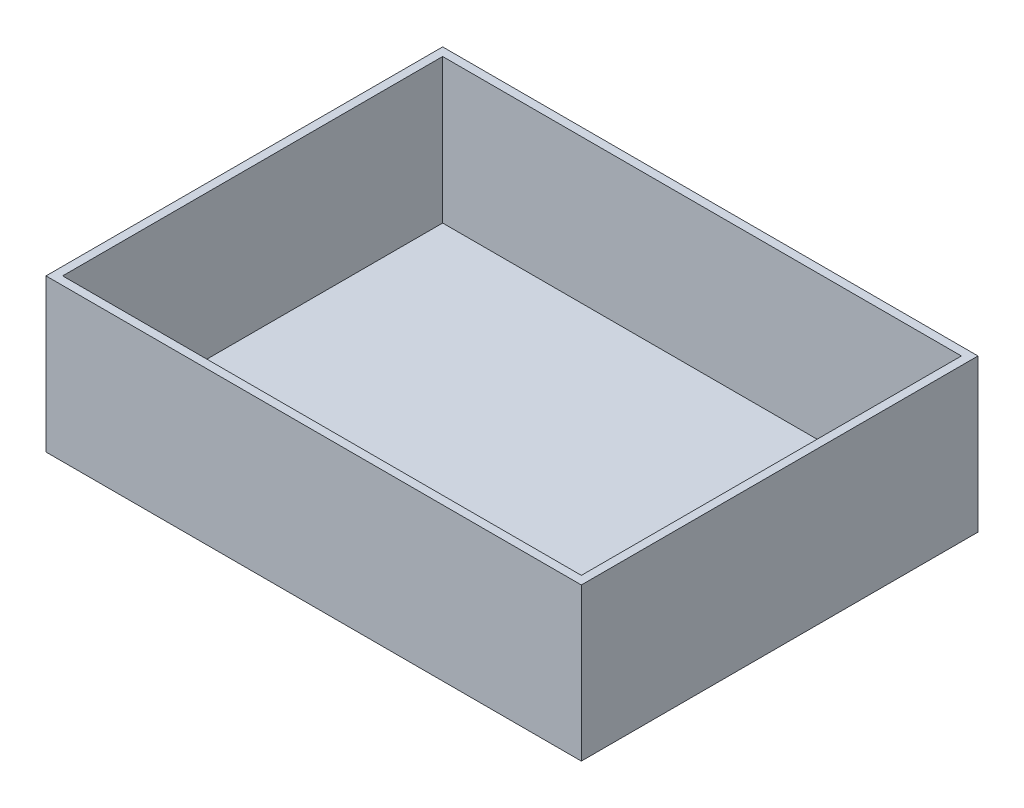
ISO-10303-21;
HEADER;
FILE_DESCRIPTION(('STEP AP214'),'2;1');
FILE_NAME('part.step','',(''),(''),'','','');
FILE_SCHEMA(('AUTOMOTIVE_DESIGN { 1 0 10303 214 1 1 1 1 }'));
ENDSEC;
DATA;
#1=APPLICATION_CONTEXT('core data for automotive mechanical design processes');
#2=APPLICATION_PROTOCOL_DEFINITION('international standard','automotive_design',2000,#1);
#3=PRODUCT_CONTEXT('',#1,'mechanical');
#4=PRODUCT('Part','Part','',(#3));
#5=PRODUCT_RELATED_PRODUCT_CATEGORY('part','',(#4));
#6=PRODUCT_DEFINITION_FORMATION('','',#4);
#7=PRODUCT_DEFINITION_CONTEXT('part definition',#1,'design');
#8=PRODUCT_DEFINITION('design','',#6,#7);
#9=PRODUCT_DEFINITION_SHAPE('','',#8);
#10=(LENGTH_UNIT() NAMED_UNIT(*) SI_UNIT(.MILLI.,.METRE.));
#11=(NAMED_UNIT(*) PLANE_ANGLE_UNIT() SI_UNIT($,.RADIAN.));
#12=(NAMED_UNIT(*) SI_UNIT($,.STERADIAN.) SOLID_ANGLE_UNIT());
#13=UNCERTAINTY_MEASURE_WITH_UNIT(LENGTH_MEASURE(1.E-05),#10,'distance_accuracy_value','');
#14=(GEOMETRIC_REPRESENTATION_CONTEXT(3) GLOBAL_UNCERTAINTY_ASSIGNED_CONTEXT((#13)) GLOBAL_UNIT_ASSIGNED_CONTEXT((#10,
#11,#12)) REPRESENTATION_CONTEXT('',''));
#15=CARTESIAN_POINT('',(0.,0.,0.));
#16=DIRECTION('',(0.,0.,1.));
#17=DIRECTION('',(1.,0.,0.));
#18=AXIS2_PLACEMENT_3D('',#15,#16,#17);
#19=CARTESIAN_POINT('',(0.,55.,0.));
#20=DIRECTION('',(0.,-1.,0.));
#21=DIRECTION('',(0.,0.,-1.));
#22=AXIS2_PLACEMENT_3D('',#19,#20,#21);
#23=PLANE('',#22);
#24=DIRECTION('',(0.,0.,-1.));
#25=VECTOR('',#24,1.);
#26=CARTESIAN_POINT('',(96.5,55.,71.5));
#27=LINE('',#26,#25);
#28=CARTESIAN_POINT('',(96.5,55.,71.5));
#29=VERTEX_POINT('',#28);
#30=CARTESIAN_POINT('',(96.5,55.,-71.5));
#31=VERTEX_POINT('',#30);
#32=EDGE_CURVE('E141',#29,#31,#27,.T.);
#33=ORIENTED_EDGE('',*,*,#32,.T.);
#34=DIRECTION('',(-1.,0.,0.));
#35=VECTOR('',#34,1.);
#36=CARTESIAN_POINT('',(-96.5,55.,-71.5));
#37=LINE('',#36,#35);
#38=CARTESIAN_POINT('',(-96.5,55.,-71.5));
#39=VERTEX_POINT('',#38);
#40=EDGE_CURVE('E85',#31,#39,#37,.T.);
#41=ORIENTED_EDGE('',*,*,#40,.T.);
#42=DIRECTION('',(0.,0.,1.));
#43=VECTOR('',#42,1.);
#44=CARTESIAN_POINT('',(-96.5,55.,71.5));
#45=LINE('',#44,#43);
#46=CARTESIAN_POINT('',(-96.5,55.,71.5));
#47=VERTEX_POINT('',#46);
#48=EDGE_CURVE('E144',#39,#47,#45,.T.);
#49=ORIENTED_EDGE('',*,*,#48,.T.);
#50=DIRECTION('',(1.,0.,0.));
#51=VECTOR('',#50,1.);
#52=CARTESIAN_POINT('',(-96.5,55.,71.5));
#53=LINE('',#52,#51);
#54=EDGE_CURVE('E57',#47,#29,#53,.T.);
#55=ORIENTED_EDGE('',*,*,#54,.T.);
#56=EDGE_LOOP('',(#33,#41,#49,#55));
#57=FACE_BOUND('',#56,.T.);
#58=DIRECTION('',(0.,0.,-1.));
#59=VECTOR('',#58,1.);
#60=CARTESIAN_POINT('',(93.5,55.,0.));
#61=LINE('',#60,#59);
#62=CARTESIAN_POINT('',(93.5,55.,68.5));
#63=VERTEX_POINT('',#62);
#64=CARTESIAN_POINT('',(93.5,55.,-68.5));
#65=VERTEX_POINT('',#64);
#66=EDGE_CURVE('E130',#63,#65,#61,.T.);
#67=ORIENTED_EDGE('',*,*,#66,.F.);
#68=DIRECTION('',(1.,0.,0.));
#69=VECTOR('',#68,1.);
#70=CARTESIAN_POINT('',(0.,55.,68.5));
#71=LINE('',#70,#69);
#72=CARTESIAN_POINT('',(-93.5,55.,68.5));
#73=VERTEX_POINT('',#72);
#74=EDGE_CURVE('E139',#73,#63,#71,.T.);
#75=ORIENTED_EDGE('',*,*,#74,.F.);
#76=DIRECTION('',(0.,0.,1.));
#77=VECTOR('',#76,1.);
#78=CARTESIAN_POINT('',(-93.5,55.,0.));
#79=LINE('',#78,#77);
#80=CARTESIAN_POINT('',(-93.5,55.,-68.5));
#81=VERTEX_POINT('',#80);
#82=EDGE_CURVE('E137',#81,#73,#79,.T.);
#83=ORIENTED_EDGE('',*,*,#82,.F.);
#84=DIRECTION('',(-1.,0.,0.));
#85=VECTOR('',#84,1.);
#86=CARTESIAN_POINT('',(0.,55.,-68.5));
#87=LINE('',#86,#85);
#88=EDGE_CURVE('E122',#65,#81,#87,.T.);
#89=ORIENTED_EDGE('',*,*,#88,.F.);
#90=EDGE_LOOP('',(#67,#75,#83,#89));
#91=FACE_BOUND('',#90,.T.);
#92=ADVANCED_FACE('F33',(#57,#91),#23,.F.);
#93=CARTESIAN_POINT('',(96.5,55.,71.5));
#94=DIRECTION('',(-1.,0.,0.));
#95=DIRECTION('',(0.,0.,1.));
#96=AXIS2_PLACEMENT_3D('',#93,#94,#95);
#97=PLANE('',#96);
#98=DIRECTION('',(0.,0.,-1.));
#99=VECTOR('',#98,1.);
#100=CARTESIAN_POINT('',(96.5,0.,71.5));
#101=LINE('',#100,#99);
#102=CARTESIAN_POINT('',(96.5,0.,71.5));
#103=VERTEX_POINT('',#102);
#104=CARTESIAN_POINT('',(96.5,0.,-71.5));
#105=VERTEX_POINT('',#104);
#106=EDGE_CURVE('E148',#103,#105,#101,.T.);
#107=ORIENTED_EDGE('',*,*,#106,.T.);
#108=DIRECTION('',(0.,-1.,0.));
#109=VECTOR('',#108,1.);
#110=CARTESIAN_POINT('',(96.5,55.,-71.5));
#111=LINE('',#110,#109);
#112=EDGE_CURVE('E11',#31,#105,#111,.T.);
#113=ORIENTED_EDGE('',*,*,#112,.F.);
#114=ORIENTED_EDGE('',*,*,#32,.F.);
#115=DIRECTION('',(0.,-1.,0.));
#116=VECTOR('',#115,1.);
#117=CARTESIAN_POINT('',(96.5,55.,71.5));
#118=LINE('',#117,#116);
#119=EDGE_CURVE('E147',#29,#103,#118,.T.);
#120=ORIENTED_EDGE('',*,*,#119,.T.);
#121=EDGE_LOOP('',(#107,#113,#114,#120));
#122=FACE_BOUND('',#121,.T.);
#123=ADVANCED_FACE('F35',(#122),#97,.F.);
#124=CARTESIAN_POINT('',(-96.5,55.,-71.5));
#125=DIRECTION('',(0.,0.,1.));
#126=DIRECTION('',(1.,0.,0.));
#127=AXIS2_PLACEMENT_3D('',#124,#125,#126);
#128=PLANE('',#127);
#129=DIRECTION('',(-1.,0.,0.));
#130=VECTOR('',#129,1.);
#131=CARTESIAN_POINT('',(-96.5,0.,-71.5));
#132=LINE('',#131,#130);
#133=CARTESIAN_POINT('',(-96.5,0.,-71.5));
#134=VERTEX_POINT('',#133);
#135=EDGE_CURVE('E151',#105,#134,#132,.T.);
#136=ORIENTED_EDGE('',*,*,#135,.T.);
#137=DIRECTION('',(0.,-1.,0.));
#138=VECTOR('',#137,1.);
#139=CARTESIAN_POINT('',(-96.5,55.,-71.5));
#140=LINE('',#139,#138);
#141=EDGE_CURVE('E41',#39,#134,#140,.T.);
#142=ORIENTED_EDGE('',*,*,#141,.F.);
#143=ORIENTED_EDGE('',*,*,#40,.F.);
#144=ORIENTED_EDGE('',*,*,#112,.T.);
#145=EDGE_LOOP('',(#136,#142,#143,#144));
#146=FACE_BOUND('',#145,.T.);
#147=ADVANCED_FACE('F179',(#146),#128,.F.);
#148=CARTESIAN_POINT('',(-96.5,55.,71.5));
#149=DIRECTION('',(1.,0.,0.));
#150=DIRECTION('',(0.,0.,-1.));
#151=AXIS2_PLACEMENT_3D('',#148,#149,#150);
#152=PLANE('',#151);
#153=DIRECTION('',(0.,0.,1.));
#154=VECTOR('',#153,1.);
#155=CARTESIAN_POINT('',(-96.5,0.,71.5));
#156=LINE('',#155,#154);
#157=CARTESIAN_POINT('',(-96.5,0.,71.5));
#158=VERTEX_POINT('',#157);
#159=EDGE_CURVE('E153',#134,#158,#156,.T.);
#160=ORIENTED_EDGE('',*,*,#159,.T.);
#161=DIRECTION('',(0.,-1.,0.));
#162=VECTOR('',#161,1.);
#163=CARTESIAN_POINT('',(-96.5,55.,71.5));
#164=LINE('',#163,#162);
#165=EDGE_CURVE('E157',#47,#158,#164,.T.);
#166=ORIENTED_EDGE('',*,*,#165,.F.);
#167=ORIENTED_EDGE('',*,*,#48,.F.);
#168=ORIENTED_EDGE('',*,*,#141,.T.);
#169=EDGE_LOOP('',(#160,#166,#167,#168));
#170=FACE_BOUND('',#169,.T.);
#171=ADVANCED_FACE('F162',(#170),#152,.F.);
#172=CARTESIAN_POINT('',(-96.5,55.,71.5));
#173=DIRECTION('',(0.,0.,-1.));
#174=DIRECTION('',(-1.,0.,0.));
#175=AXIS2_PLACEMENT_3D('',#172,#173,#174);
#176=PLANE('',#175);
#177=DIRECTION('',(1.,0.,0.));
#178=VECTOR('',#177,1.);
#179=CARTESIAN_POINT('',(-96.5,0.,71.5));
#180=LINE('',#179,#178);
#181=EDGE_CURVE('E78',#158,#103,#180,.T.);
#182=ORIENTED_EDGE('',*,*,#181,.T.);
#183=ORIENTED_EDGE('',*,*,#119,.F.);
#184=ORIENTED_EDGE('',*,*,#54,.F.);
#185=ORIENTED_EDGE('',*,*,#165,.T.);
#186=EDGE_LOOP('',(#182,#183,#184,#185));
#187=FACE_BOUND('',#186,.T.);
#188=ADVANCED_FACE('F170',(#187),#176,.F.);
#189=CARTESIAN_POINT('',(0.,0.,0.));
#190=DIRECTION('',(0.,-1.,0.));
#191=DIRECTION('',(0.,0.,-1.));
#192=AXIS2_PLACEMENT_3D('',#189,#190,#191);
#193=PLANE('',#192);
#194=ORIENTED_EDGE('',*,*,#106,.F.);
#195=ORIENTED_EDGE('',*,*,#181,.F.);
#196=ORIENTED_EDGE('',*,*,#159,.F.);
#197=ORIENTED_EDGE('',*,*,#135,.F.);
#198=EDGE_LOOP('',(#194,#195,#196,#197));
#199=FACE_BOUND('',#198,.T.);
#200=ADVANCED_FACE('F166',(#199),#193,.T.);
#201=CARTESIAN_POINT('',(93.5,55.,71.5));
#202=DIRECTION('',(-1.,0.,0.));
#203=DIRECTION('',(0.,0.,1.));
#204=AXIS2_PLACEMENT_3D('',#201,#202,#203);
#205=PLANE('',#204);
#206=DIRECTION('',(0.,0.,-1.));
#207=VECTOR('',#206,1.);
#208=CARTESIAN_POINT('',(93.5,3.,0.));
#209=LINE('',#208,#207);
#210=CARTESIAN_POINT('',(93.5,3.,68.5));
#211=VERTEX_POINT('',#210);
#212=CARTESIAN_POINT('',(93.5,3.,-68.5));
#213=VERTEX_POINT('',#212);
#214=EDGE_CURVE('E113',#211,#213,#209,.T.);
#215=ORIENTED_EDGE('',*,*,#214,.F.);
#216=DIRECTION('',(0.,-1.,0.));
#217=VECTOR('',#216,1.);
#218=CARTESIAN_POINT('',(93.5,55.,68.5));
#219=LINE('',#218,#217);
#220=EDGE_CURVE('E133',#63,#211,#219,.T.);
#221=ORIENTED_EDGE('',*,*,#220,.F.);
#222=ORIENTED_EDGE('',*,*,#66,.T.);
#223=DIRECTION('',(0.,-1.,0.));
#224=VECTOR('',#223,1.);
#225=CARTESIAN_POINT('',(93.5,55.,-68.5));
#226=LINE('',#225,#224);
#227=EDGE_CURVE('E125',#65,#213,#226,.T.);
#228=ORIENTED_EDGE('',*,*,#227,.T.);
#229=EDGE_LOOP('',(#215,#221,#222,#228));
#230=FACE_BOUND('',#229,.T.);
#231=ADVANCED_FACE('F177',(#230),#205,.T.);
#232=CARTESIAN_POINT('',(-96.5,55.,-68.5));
#233=DIRECTION('',(0.,0.,1.));
#234=DIRECTION('',(1.,0.,0.));
#235=AXIS2_PLACEMENT_3D('',#232,#233,#234);
#236=PLANE('',#235);
#237=DIRECTION('',(-1.,0.,0.));
#238=VECTOR('',#237,1.);
#239=CARTESIAN_POINT('',(0.,3.,-68.5));
#240=LINE('',#239,#238);
#241=CARTESIAN_POINT('',(-93.5,3.,-68.5));
#242=VERTEX_POINT('',#241);
#243=EDGE_CURVE('E107',#213,#242,#240,.T.);
#244=ORIENTED_EDGE('',*,*,#243,.F.);
#245=ORIENTED_EDGE('',*,*,#227,.F.);
#246=ORIENTED_EDGE('',*,*,#88,.T.);
#247=DIRECTION('',(0.,-1.,0.));
#248=VECTOR('',#247,1.);
#249=CARTESIAN_POINT('',(-93.5,55.,-68.5));
#250=LINE('',#249,#248);
#251=EDGE_CURVE('E119',#81,#242,#250,.T.);
#252=ORIENTED_EDGE('',*,*,#251,.T.);
#253=EDGE_LOOP('',(#244,#245,#246,#252));
#254=FACE_BOUND('',#253,.T.);
#255=ADVANCED_FACE('F120',(#254),#236,.T.);
#256=CARTESIAN_POINT('',(-93.5,55.,71.5));
#257=DIRECTION('',(1.,0.,0.));
#258=DIRECTION('',(0.,0.,-1.));
#259=AXIS2_PLACEMENT_3D('',#256,#257,#258);
#260=PLANE('',#259);
#261=DIRECTION('',(0.,0.,1.));
#262=VECTOR('',#261,1.);
#263=CARTESIAN_POINT('',(-93.5,3.,0.));
#264=LINE('',#263,#262);
#265=CARTESIAN_POINT('',(-93.5,3.,68.5));
#266=VERTEX_POINT('',#265);
#267=EDGE_CURVE('E111',#242,#266,#264,.T.);
#268=ORIENTED_EDGE('',*,*,#267,.F.);
#269=ORIENTED_EDGE('',*,*,#251,.F.);
#270=ORIENTED_EDGE('',*,*,#82,.T.);
#271=DIRECTION('',(0.,-1.,0.));
#272=VECTOR('',#271,1.);
#273=CARTESIAN_POINT('',(-93.5,55.,68.5));
#274=LINE('',#273,#272);
#275=EDGE_CURVE('E48',#73,#266,#274,.T.);
#276=ORIENTED_EDGE('',*,*,#275,.T.);
#277=EDGE_LOOP('',(#268,#269,#270,#276));
#278=FACE_BOUND('',#277,.T.);
#279=ADVANCED_FACE('F127',(#278),#260,.T.);
#280=CARTESIAN_POINT('',(-96.5,55.,68.5));
#281=DIRECTION('',(0.,0.,-1.));
#282=DIRECTION('',(-1.,0.,0.));
#283=AXIS2_PLACEMENT_3D('',#280,#281,#282);
#284=PLANE('',#283);
#285=DIRECTION('',(1.,0.,0.));
#286=VECTOR('',#285,1.);
#287=CARTESIAN_POINT('',(0.,3.,68.5));
#288=LINE('',#287,#286);
#289=EDGE_CURVE('E128',#266,#211,#288,.T.);
#290=ORIENTED_EDGE('',*,*,#289,.F.);
#291=ORIENTED_EDGE('',*,*,#275,.F.);
#292=ORIENTED_EDGE('',*,*,#74,.T.);
#293=ORIENTED_EDGE('',*,*,#220,.T.);
#294=EDGE_LOOP('',(#290,#291,#292,#293));
#295=FACE_BOUND('',#294,.T.);
#296=ADVANCED_FACE('F190',(#295),#284,.T.);
#297=CARTESIAN_POINT('',(0.,3.,0.));
#298=DIRECTION('',(0.,-1.,0.));
#299=DIRECTION('',(0.,0.,-1.));
#300=AXIS2_PLACEMENT_3D('',#297,#298,#299);
#301=PLANE('',#300);
#302=ORIENTED_EDGE('',*,*,#214,.T.);
#303=ORIENTED_EDGE('',*,*,#243,.T.);
#304=ORIENTED_EDGE('',*,*,#267,.T.);
#305=ORIENTED_EDGE('',*,*,#289,.T.);
#306=EDGE_LOOP('',(#302,#303,#304,#305));
#307=FACE_BOUND('',#306,.T.);
#308=ADVANCED_FACE('F109',(#307),#301,.F.);
#309=CLOSED_SHELL('',(#92,#123,#147,#171,#188,#200,#231,#255,#279,#296,#308));
#310=MANIFOLD_SOLID_BREP('B2',#309);
#311=ADVANCED_BREP_SHAPE_REPRESENTATION('',(#18,#310),#14);
#312=SHAPE_DEFINITION_REPRESENTATION(#9,#311);
ENDSEC;
END-ISO-10303-21;
